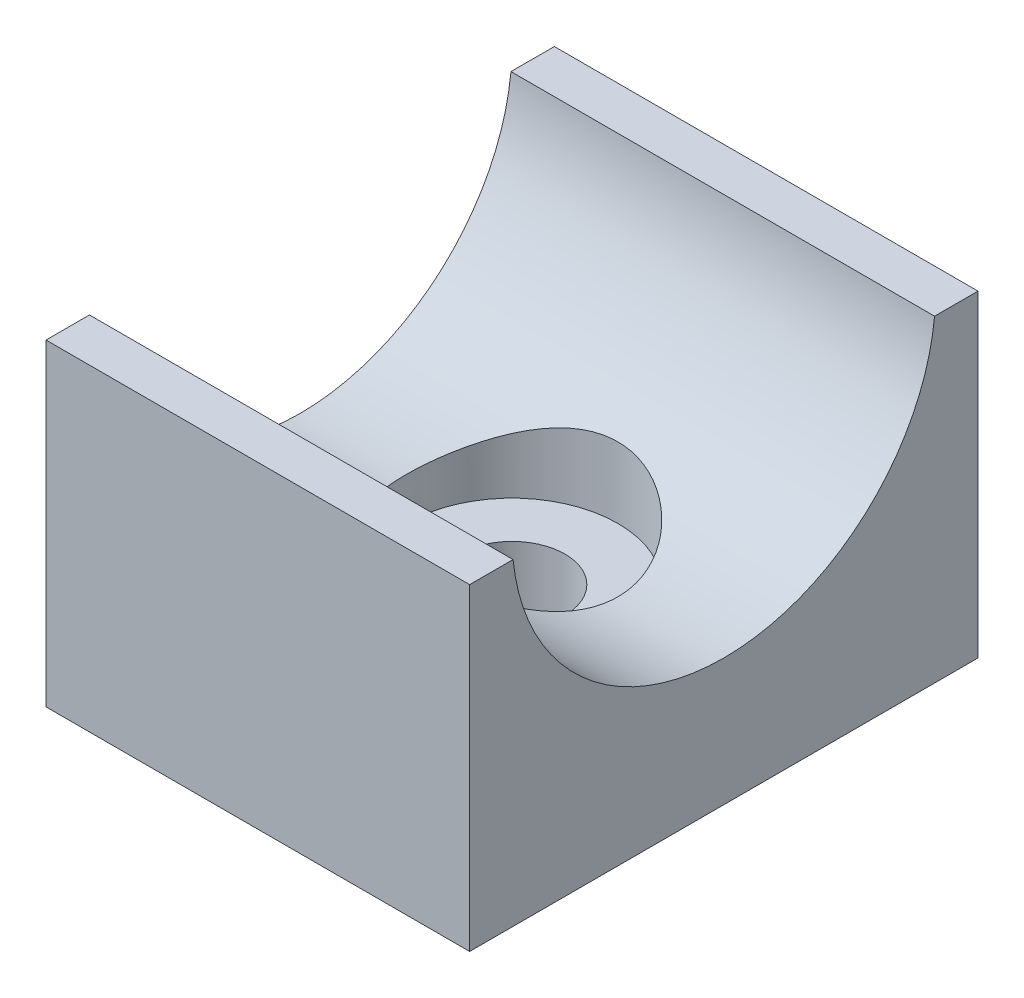
ISO-10303-21;
HEADER;
FILE_DESCRIPTION(('STEP AP214'),'2;1');
FILE_NAME('part.step','',(''),(''),'','','');
FILE_SCHEMA(('AUTOMOTIVE_DESIGN { 1 0 10303 214 1 1 1 1 }'));
ENDSEC;
DATA;
#1=APPLICATION_CONTEXT('core data for automotive mechanical design processes');
#2=APPLICATION_PROTOCOL_DEFINITION('international standard','automotive_design',2000,#1);
#3=PRODUCT_CONTEXT('',#1,'mechanical');
#4=PRODUCT('Part','Part','',(#3));
#5=PRODUCT_RELATED_PRODUCT_CATEGORY('part','',(#4));
#6=PRODUCT_DEFINITION_FORMATION('','',#4);
#7=PRODUCT_DEFINITION_CONTEXT('part definition',#1,'design');
#8=PRODUCT_DEFINITION('design','',#6,#7);
#9=PRODUCT_DEFINITION_SHAPE('','',#8);
#10=(LENGTH_UNIT() NAMED_UNIT(*) SI_UNIT(.MILLI.,.METRE.));
#11=(NAMED_UNIT(*) PLANE_ANGLE_UNIT() SI_UNIT($,.RADIAN.));
#12=(NAMED_UNIT(*) SI_UNIT($,.STERADIAN.) SOLID_ANGLE_UNIT());
#13=UNCERTAINTY_MEASURE_WITH_UNIT(LENGTH_MEASURE(1.E-05),#10,'distance_accuracy_value','');
#14=(GEOMETRIC_REPRESENTATION_CONTEXT(3) GLOBAL_UNCERTAINTY_ASSIGNED_CONTEXT((#13)) GLOBAL_UNIT_ASSIGNED_CONTEXT((#10,
#11,#12)) REPRESENTATION_CONTEXT('',''));
#15=CARTESIAN_POINT('',(0.,0.,0.));
#16=DIRECTION('',(0.,0.,1.));
#17=DIRECTION('',(1.,0.,0.));
#18=AXIS2_PLACEMENT_3D('',#15,#16,#17);
#19=CARTESIAN_POINT('',(12.7,19.05,-15.24));
#20=DIRECTION('',(0.,-1.,0.));
#21=DIRECTION('',(0.,0.,-1.));
#22=AXIS2_PLACEMENT_3D('',#19,#20,#21);
#23=CYLINDRICAL_SURFACE('',#22,3.175);
#24=CARTESIAN_POINT('',(12.7,0.,-15.24));
#25=DIRECTION('',(0.,1.,0.));
#26=DIRECTION('',(0.,0.,1.));
#27=AXIS2_PLACEMENT_3D('',#24,#25,#26);
#28=CIRCLE('',#27,3.175);
#29=CARTESIAN_POINT('',(12.7,0.,-12.065));
#30=VERTEX_POINT('',#29);
#31=EDGE_CURVE('E138',#30,#30,#28,.T.);
#32=ORIENTED_EDGE('',*,*,#31,.F.);
#33=EDGE_LOOP('',(#32));
#34=FACE_BOUND('',#33,.T.);
#35=CARTESIAN_POINT('',(12.7,5.08,-15.24));
#36=DIRECTION('',(0.,1.,0.));
#37=DIRECTION('',(0.,0.,1.));
#38=AXIS2_PLACEMENT_3D('',#35,#36,#37);
#39=CIRCLE('',#38,3.175);
#40=CARTESIAN_POINT('',(12.7,5.08,-12.065));
#41=VERTEX_POINT('',#40);
#42=EDGE_CURVE('E150',#41,#41,#39,.F.);
#43=ORIENTED_EDGE('',*,*,#42,.F.);
#44=EDGE_LOOP('',(#43));
#45=FACE_BOUND('',#44,.T.);
#46=ADVANCED_FACE('F42',(#34,#45),#23,.F.);
#47=CARTESIAN_POINT('',(25.4,0.,0.));
#48=DIRECTION('',(0.,0.,-1.));
#49=DIRECTION('',(-1.,0.,0.));
#50=AXIS2_PLACEMENT_3D('',#47,#48,#49);
#51=PLANE('',#50);
#52=DIRECTION('',(0.,-1.,0.));
#53=VECTOR('',#52,1.);
#54=CARTESIAN_POINT('',(0.,0.,0.));
#55=LINE('',#54,#53);
#56=CARTESIAN_POINT('',(0.,19.05,0.));
#57=VERTEX_POINT('',#56);
#58=CARTESIAN_POINT('',(0.,0.,0.));
#59=VERTEX_POINT('',#58);
#60=EDGE_CURVE('E134',#57,#59,#55,.T.);
#61=ORIENTED_EDGE('',*,*,#60,.T.);
#62=DIRECTION('',(-1.,0.,0.));
#63=VECTOR('',#62,1.);
#64=CARTESIAN_POINT('',(25.4,0.,0.));
#65=LINE('',#64,#63);
#66=CARTESIAN_POINT('',(25.4,0.,0.));
#67=VERTEX_POINT('',#66);
#68=EDGE_CURVE('E12',#67,#59,#65,.T.);
#69=ORIENTED_EDGE('',*,*,#68,.F.);
#70=DIRECTION('',(0.,-1.,0.));
#71=VECTOR('',#70,1.);
#72=CARTESIAN_POINT('',(25.4,0.,0.));
#73=LINE('',#72,#71);
#74=CARTESIAN_POINT('',(25.4,19.05,0.));
#75=VERTEX_POINT('',#74);
#76=EDGE_CURVE('E145',#75,#67,#73,.T.);
#77=ORIENTED_EDGE('',*,*,#76,.F.);
#78=DIRECTION('',(-1.,0.,0.));
#79=VECTOR('',#78,1.);
#80=CARTESIAN_POINT('',(25.4,19.05,0.));
#81=LINE('',#80,#79);
#82=EDGE_CURVE('E130',#75,#57,#81,.T.);
#83=ORIENTED_EDGE('',*,*,#82,.T.);
#84=EDGE_LOOP('',(#61,#69,#77,#83));
#85=FACE_BOUND('',#84,.T.);
#86=ADVANCED_FACE('F44',(#85),#51,.F.);
#87=CARTESIAN_POINT('',(25.4,0.,0.));
#88=DIRECTION('',(0.,1.,0.));
#89=DIRECTION('',(0.,0.,1.));
#90=AXIS2_PLACEMENT_3D('',#87,#88,#89);
#91=PLANE('',#90);
#92=ORIENTED_EDGE('',*,*,#31,.T.);
#93=EDGE_LOOP('',(#92));
#94=FACE_BOUND('',#93,.T.);
#95=DIRECTION('',(0.,0.,-1.));
#96=VECTOR('',#95,1.);
#97=CARTESIAN_POINT('',(0.,0.,0.));
#98=LINE('',#97,#96);
#99=CARTESIAN_POINT('',(0.,0.,-30.48));
#100=VERTEX_POINT('',#99);
#101=EDGE_CURVE('E137',#59,#100,#98,.T.);
#102=ORIENTED_EDGE('',*,*,#101,.T.);
#103=DIRECTION('',(-1.,0.,0.));
#104=VECTOR('',#103,1.);
#105=CARTESIAN_POINT('',(25.4,0.,-30.48));
#106=LINE('',#105,#104);
#107=CARTESIAN_POINT('',(25.4,0.,-30.48));
#108=VERTEX_POINT('',#107);
#109=EDGE_CURVE('E57',#108,#100,#106,.T.);
#110=ORIENTED_EDGE('',*,*,#109,.F.);
#111=DIRECTION('',(0.,0.,-1.));
#112=VECTOR('',#111,1.);
#113=CARTESIAN_POINT('',(25.4,0.,0.));
#114=LINE('',#113,#112);
#115=EDGE_CURVE('E103',#67,#108,#114,.T.);
#116=ORIENTED_EDGE('',*,*,#115,.F.);
#117=ORIENTED_EDGE('',*,*,#68,.T.);
#118=EDGE_LOOP('',(#102,#110,#116,#117));
#119=FACE_BOUND('',#118,.T.);
#120=ADVANCED_FACE('F166',(#94,#119),#91,.F.);
#121=CARTESIAN_POINT('',(25.4,0.,-30.48));
#122=DIRECTION('',(0.,0.,1.));
#123=DIRECTION('',(1.,0.,0.));
#124=AXIS2_PLACEMENT_3D('',#121,#122,#123);
#125=PLANE('',#124);
#126=DIRECTION('',(0.,1.,0.));
#127=VECTOR('',#126,1.);
#128=CARTESIAN_POINT('',(0.,0.,-30.48));
#129=LINE('',#128,#127);
#130=CARTESIAN_POINT('',(0.,19.05,-30.48));
#131=VERTEX_POINT('',#130);
#132=EDGE_CURVE('E140',#100,#131,#129,.T.);
#133=ORIENTED_EDGE('',*,*,#132,.T.);
#134=DIRECTION('',(-1.,0.,0.));
#135=VECTOR('',#134,1.);
#136=CARTESIAN_POINT('',(25.4,19.05,-30.48));
#137=LINE('',#136,#135);
#138=CARTESIAN_POINT('',(25.4,19.05,-30.48));
#139=VERTEX_POINT('',#138);
#140=EDGE_CURVE('E125',#139,#131,#137,.T.);
#141=ORIENTED_EDGE('',*,*,#140,.F.);
#142=DIRECTION('',(0.,1.,0.));
#143=VECTOR('',#142,1.);
#144=CARTESIAN_POINT('',(25.4,0.,-30.48));
#145=LINE('',#144,#143);
#146=EDGE_CURVE('E116',#108,#139,#145,.T.);
#147=ORIENTED_EDGE('',*,*,#146,.F.);
#148=ORIENTED_EDGE('',*,*,#109,.T.);
#149=EDGE_LOOP('',(#133,#141,#147,#148));
#150=FACE_BOUND('',#149,.T.);
#151=ADVANCED_FACE('F169',(#150),#125,.F.);
#152=CARTESIAN_POINT('',(25.4,19.05,-27.8763404512541));
#153=DIRECTION('',(0.,-1.,0.));
#154=DIRECTION('',(0.,0.,-1.));
#155=AXIS2_PLACEMENT_3D('',#152,#153,#154);
#156=PLANE('',#155);
#157=DIRECTION('',(0.,0.,1.));
#158=VECTOR('',#157,1.);
#159=CARTESIAN_POINT('',(0.,19.05,-27.8763404512541));
#160=LINE('',#159,#158);
#161=CARTESIAN_POINT('',(0.,19.05,-27.8763404512541));
#162=VERTEX_POINT('',#161);
#163=EDGE_CURVE('E124',#131,#162,#160,.T.);
#164=ORIENTED_EDGE('',*,*,#163,.T.);
#165=DIRECTION('',(-1.,0.,0.));
#166=VECTOR('',#165,1.);
#167=CARTESIAN_POINT('',(25.4,19.05,-27.8763404512541));
#168=LINE('',#167,#166);
#169=CARTESIAN_POINT('',(25.4,19.05,-27.8763404512541));
#170=VERTEX_POINT('',#169);
#171=EDGE_CURVE('E121',#170,#162,#168,.T.);
#172=ORIENTED_EDGE('',*,*,#171,.F.);
#173=DIRECTION('',(0.,0.,1.));
#174=VECTOR('',#173,1.);
#175=CARTESIAN_POINT('',(25.4,19.05,-27.8763404512541));
#176=LINE('',#175,#174);
#177=EDGE_CURVE('E110',#139,#170,#176,.T.);
#178=ORIENTED_EDGE('',*,*,#177,.F.);
#179=ORIENTED_EDGE('',*,*,#140,.T.);
#180=EDGE_LOOP('',(#164,#172,#178,#179));
#181=FACE_BOUND('',#180,.T.);
#182=ADVANCED_FACE('F122',(#181),#156,.F.);
#183=CARTESIAN_POINT('',(25.4,20.32,-15.24));
#184=DIRECTION('',(-1.,0.,0.));
#185=DIRECTION('',(0.,0.,1.));
#186=AXIS2_PLACEMENT_3D('',#183,#184,#185);
#187=CYLINDRICAL_SURFACE('',#186,12.7);
#188=CARTESIAN_POINT('',(12.7,9.32147737193762,-8.89));
#189=CARTESIAN_POINT('',(12.5344789590249,9.32147642005699,-8.89000071781161));
#190=CARTESIAN_POINT('',(12.3689434883732,9.31772810661446,-8.8964804349605));
#191=CARTESIAN_POINT('',(12.0391482505555,9.30287403604474,-8.92231432961333));
#192=CARTESIAN_POINT('',(11.8748891133291,9.29176485365803,-8.9416745008423));
#193=CARTESIAN_POINT('',(11.5487301381977,9.26258186670705,-8.99305072320687));
#194=CARTESIAN_POINT('',(11.3868344150542,9.24449714114095,-9.02508662166783));
#195=CARTESIAN_POINT('',(11.0667491150663,9.20200448634721,-9.10142682606322));
#196=CARTESIAN_POINT('',(10.9085611824029,9.1775938076974,-9.14573646706065));
#197=CARTESIAN_POINT('',(10.5978491070273,9.12342590997942,-9.24584096724941));
#198=CARTESIAN_POINT('',(10.4452974262377,9.09370053604643,-9.3015676917048));
#199=CARTESIAN_POINT('',(10.1456891130139,9.02971423338027,-9.42413991964666));
#200=CARTESIAN_POINT('',(9.99863463418856,8.995451550481,-9.49098972599722));
#201=CARTESIAN_POINT('',(9.56692148410001,8.88731966845245,-9.7073875338395));
#202=CARTESIAN_POINT('',(9.29141909818349,8.80805233577874,-9.87287966548104));
#203=CARTESIAN_POINT('',(8.7483163070679,8.63619282928589,-10.2573747996654));
#204=CARTESIAN_POINT('',(8.48324177727992,8.54304087481058,-10.4796654905097));
#205=CARTESIAN_POINT('',(7.99203943621564,8.35837017285472,-10.964882423539));
#206=CARTESIAN_POINT('',(7.7659310521132,8.26685226031537,-11.2278288120233));
#207=CARTESIAN_POINT('',(7.45333912917879,8.13454664585376,-11.6581810588134));
#208=CARTESIAN_POINT('',(7.3508668908084,8.08998050886684,-11.8130595701572));
#209=CARTESIAN_POINT('',(7.1594595117803,8.00506092389924,-12.1320334696156));
#210=CARTESIAN_POINT('',(7.07051859795496,7.96470568165328,-12.2961248858836));
#211=CARTESIAN_POINT('',(6.90705206170794,7.88937307174371,-12.6324691683083));
#212=CARTESIAN_POINT('',(6.83252293166016,7.85439439592537,-12.8047200358308));
#213=CARTESIAN_POINT('',(6.69870264323527,7.79085002705441,-13.1561878375221));
#214=CARTESIAN_POINT('',(6.639409866327,7.76228365287499,-13.3354040294464));
#215=CARTESIAN_POINT('',(6.54048157500691,7.71423005093735,-13.6863988982515));
#216=CARTESIAN_POINT('',(6.49974775386153,7.69424152040074,-13.8577997429495));
#217=CARTESIAN_POINT('',(6.4325940667158,7.66112875165631,-14.2040398980828));
#218=CARTESIAN_POINT('',(6.40617357837659,7.64800421500522,-14.3788790586787));
#219=CARTESIAN_POINT('',(6.36800870358457,7.62900556174312,-14.7304543290938));
#220=CARTESIAN_POINT('',(6.35625683819261,7.62312775033797,-14.9071894258518));
#221=CARTESIAN_POINT('',(6.34756882551003,7.61878486541447,-15.2611100399709));
#222=CARTESIAN_POINT('',(6.3506317717729,7.62031933837436,-15.4382955291118));
#223=CARTESIAN_POINT('',(6.37061265961288,7.6302962444174,-15.776139024534));
#224=CARTESIAN_POINT('',(6.38629814259088,7.63812413040212,-15.9368899245854));
#225=CARTESIAN_POINT('',(6.42979708099145,7.65972403867592,-16.2563936420842));
#226=CARTESIAN_POINT('',(6.4576146420864,7.67349807321244,-16.4151457643874));
#227=CARTESIAN_POINT('',(6.52506340961893,7.7066546514692,-16.7294584532589));
#228=CARTESIAN_POINT('',(6.56469052945482,7.72603525501402,-16.8850201039935));
#229=CARTESIAN_POINT('',(6.65537335198242,7.76996260027213,-17.1920837525932));
#230=CARTESIAN_POINT('',(6.70643343198866,7.79451132047609,-17.3435841705995));
#231=CARTESIAN_POINT('',(6.82026333653132,7.8485822881302,-17.6435961838837));
#232=CARTESIAN_POINT('',(6.88318090551182,7.87816677380177,-17.792040524012));
#233=CARTESIAN_POINT('',(7.01972673480682,7.94141556785704,-18.0830375380318));
#234=CARTESIAN_POINT('',(7.09335886519499,7.97508134965865,-18.2255880590976));
#235=CARTESIAN_POINT('',(7.32950455790233,8.08113324347405,-18.6433007767467));
#236=CARTESIAN_POINT('',(7.50733700752065,8.15860800871235,-18.9087059488456));
#237=CARTESIAN_POINT('',(7.91779428710195,8.32838567884807,-19.4321422277039));
#238=CARTESIAN_POINT('',(8.1540094889112,8.42139797894205,-19.6871047743945));
#239=CARTESIAN_POINT('',(8.66518952816838,8.60716102954958,-20.1555793654645));
#240=CARTESIAN_POINT('',(8.94018390104014,8.6999115252269,-20.369059518092));
#241=CARTESIAN_POINT('',(9.38681881570323,8.83423638001303,-20.6603046983943));
#242=CARTESIAN_POINT('',(9.54665968738573,8.87946071878235,-20.7548525398925));
#243=CARTESIAN_POINT('',(9.87490752306776,8.96554731809776,-20.9299830866792));
#244=CARTESIAN_POINT('',(10.0433105782878,9.00641154317183,-21.0105720916642));
#245=CARTESIAN_POINT('',(10.3875884792423,9.08226999906691,-21.1569441469152));
#246=CARTESIAN_POINT('',(10.5634588389774,9.11726769339595,-21.2227359411201));
#247=CARTESIAN_POINT('',(10.9215191016147,9.1800064719304,-21.3387624046693));
#248=CARTESIAN_POINT('',(11.1037081390407,9.20774854553506,-21.3889991953146));
#249=CARTESIAN_POINT('',(11.4582606725721,9.25288691298729,-21.4698457856101));
#250=CARTESIAN_POINT('',(11.6302596051572,9.27092855783565,-21.5016948889478));
#251=CARTESIAN_POINT('',(11.9769418024487,9.2990889592453,-21.5511279129572));
#252=CARTESIAN_POINT('',(12.1516249148929,9.30920816353379,-21.5687126397652));
#253=CARTESIAN_POINT('',(12.5020265041789,9.32108860826949,-21.5893378336054));
#254=CARTESIAN_POINT('',(12.677744291214,9.32285489805144,-21.5923870873364));
#255=CARTESIAN_POINT('',(13.0287031999384,9.3179653426303,-21.5839151277121));
#256=CARTESIAN_POINT('',(13.2039443530021,9.31131006591665,-21.5723948978553));
#257=CARTESIAN_POINT('',(13.5332279332373,9.29104779310985,-21.5370285883473));
#258=CARTESIAN_POINT('',(13.6874858524856,9.2782840465986,-21.5146742712527));
#259=CARTESIAN_POINT('',(13.9933945378934,9.24673425861895,-21.458827425562));
#260=CARTESIAN_POINT('',(14.1450444243412,9.22794622551699,-21.4253312133101));
#261=CARTESIAN_POINT('',(14.4447439677597,9.18493632621383,-21.3475630763557));
#262=CARTESIAN_POINT('',(14.5927940903662,9.16071516698612,-21.3032925535728));
#263=CARTESIAN_POINT('',(14.8845425415143,9.10754654597483,-21.2043974165212));
#264=CARTESIAN_POINT('',(15.0282391462377,9.07859724029688,-21.1497687614191));
#265=CARTESIAN_POINT('',(15.4646936868604,8.98297171876334,-20.9655153726592));
#266=CARTESIAN_POINT('',(15.7490987796552,8.90958388309908,-20.8190770886179));
#267=CARTESIAN_POINT('',(16.2907678711839,8.75308318122911,-20.4869180698689));
#268=CARTESIAN_POINT('',(16.5480178254445,8.66996532912947,-20.3011771558361));
#269=CARTESIAN_POINT('',(17.062333653309,8.49070205678713,-19.8680776263864));
#270=CARTESIAN_POINT('',(17.3152886641333,8.39423517674652,-19.6159031911332));
#271=CARTESIAN_POINT('',(17.6610339893589,8.25483316513904,-19.207691399765));
#272=CARTESIAN_POINT('',(17.7707339818866,8.20921829168895,-19.0665178993435));
#273=CARTESIAN_POINT('',(17.9782052877834,8.1208959823283,-18.7748308921695));
#274=CARTESIAN_POINT('',(18.0759816587189,8.07818731713155,-18.6243213865676));
#275=CARTESIAN_POINT('',(18.2613143065594,7.99568889377902,-18.3105667622671));
#276=CARTESIAN_POINT('',(18.3485234397142,7.95600905451601,-18.1470875265675));
#277=CARTESIAN_POINT('',(18.5086782023377,7.88202591310086,-17.8121944107138));
#278=CARTESIAN_POINT('',(18.581630149332,7.84772023094012,-17.6407840867503));
#279=CARTESIAN_POINT('',(18.712454756968,7.78549557312906,-17.2912653593288));
#280=CARTESIAN_POINT('',(18.7703346102331,7.75757355188161,-17.1131601973542));
#281=CARTESIAN_POINT('',(18.870307055066,7.70896207828177,-16.7516132994379));
#282=CARTESIAN_POINT('',(18.9124015187094,7.68827176830096,-16.5681721990965));
#283=CARTESIAN_POINT('',(18.9770955767513,7.65632292993781,-16.2146000051003));
#284=CARTESIAN_POINT('',(19.0011298887925,7.64437300817646,-16.0447926586732));
#285=CARTESIAN_POINT('',(19.035386692103,7.62730912682273,-15.7034536509147));
#286=CARTESIAN_POINT('',(19.0456102505118,7.62219463906534,-15.5319221238406));
#287=CARTESIAN_POINT('',(19.0521123246777,7.61894399676094,-15.1885802771935));
#288=CARTESIAN_POINT('',(19.0483948989078,7.62080581128592,-15.0167700533108));
#289=CARTESIAN_POINT('',(19.0270728992273,7.63145140008471,-14.6742330527926));
#290=CARTESIAN_POINT('',(19.0094687076187,7.64023498380262,-14.5035062464611));
#291=CARTESIAN_POINT('',(18.9622218272353,7.66367612437398,-14.175737056103));
#292=CARTESIAN_POINT('',(18.9334531330578,7.67790638123025,-14.0185368992336));
#293=CARTESIAN_POINT('',(18.8643046584649,7.71185801081381,-13.7072659863428));
#294=CARTESIAN_POINT('',(18.8239211806658,7.7315811320446,-13.553196243587));
#295=CARTESIAN_POINT('',(18.7319617054456,7.77605947329654,-13.2492350945107));
#296=CARTESIAN_POINT('',(18.6803888595822,7.80081327626966,-13.0993425250498));
#297=CARTESIAN_POINT('',(18.5664919983685,7.8548198903757,-12.8044785072228));
#298=CARTESIAN_POINT('',(18.5041637996234,7.88407445163864,-12.6595090000851));
#299=CARTESIAN_POINT('',(18.3664096224425,7.94778075787735,-12.3692535813078));
#300=CARTESIAN_POINT('',(18.29054054922,7.98240020124094,-12.2242145681467));
#301=CARTESIAN_POINT('',(18.1282602370123,8.05508019657877,-11.9410384656085));
#302=CARTESIAN_POINT('',(18.0418454042382,8.09314192046451,-11.8029037518132));
#303=CARTESIAN_POINT('',(17.7676597433025,8.21126897076233,-11.3998350317219));
#304=CARTESIAN_POINT('',(17.564880017551,8.2953085137682,-11.1460947568409));
#305=CARTESIAN_POINT('',(17.1017684417529,8.47545654919583,-10.6494212249474));
#306=CARTESIAN_POINT('',(16.8377173779495,8.57193379552623,-10.4100765968772));
#307=CARTESIAN_POINT('',(16.4136550577774,8.71220424369563,-10.0860674657194));
#308=CARTESIAN_POINT('',(16.2675022963636,8.75825691382497,-9.98382803174278));
#309=CARTESIAN_POINT('',(15.9664359706633,8.84757906313297,-9.79162677679355));
#310=CARTESIAN_POINT('',(15.8115211914929,8.89084815457237,-9.70166666432259));
#311=CARTESIAN_POINT('',(15.4886795013925,8.97455317649323,-9.53210440726203));
#312=CARTESIAN_POINT('',(15.3204948696752,9.01485420098483,-9.4529256564071));
#313=CARTESIAN_POINT('',(14.9767752598389,9.08954607975584,-9.30927824966651));
#314=CARTESIAN_POINT('',(14.8012441228511,9.12393997573909,-9.24480201750813));
#315=CARTESIAN_POINT('',(14.4444647481629,9.18537538463023,-9.13145791935267));
#316=CARTESIAN_POINT('',(14.2632325648742,9.21243578486616,-9.08254989972412));
#317=CARTESIAN_POINT('',(13.8962222449426,9.25811246698112,-9.00086148892017));
#318=CARTESIAN_POINT('',(13.7104473824064,9.27673465197466,-8.96806982187933));
#319=CARTESIAN_POINT('',(13.3870728150317,9.30087619267086,-8.92578476265151));
#320=CARTESIAN_POINT('',(13.2501333121901,9.30858286496157,-8.91237829471656));
#321=CARTESIAN_POINT('',(12.9754659050201,9.31888402164473,-8.89448531636533));
#322=CARTESIAN_POINT('',(12.8377379485673,9.32147816404288,-8.88999940267473));
#323=CARTESIAN_POINT('',(12.7,9.32147737193762,-8.89));
#324=B_SPLINE_CURVE_WITH_KNOTS('',3,(#188,#189,#190,#191,#192,#193,#194,#195,#196,#197,#198,
#199,#200,#201,#202,#203,#204,#205,#206,#207,#208,#209,#210,#211,#212,#213,#214,#215,#216,#217,
#218,#219,#220,#221,#222,#223,#224,#225,#226,#227,#228,#229,#230,#231,#232,#233,#234,#235,#236,
#237,#238,#239,#240,#241,#242,#243,#244,#245,#246,#247,#248,#249,#250,#251,#252,#253,#254,#255,
#256,#257,#258,#259,#260,#261,#262,#263,#264,#265,#266,#267,#268,#269,#270,#271,#272,#273,#274,
#275,#276,#277,#278,#279,#280,#281,#282,#283,#284,#285,#286,#287,#288,#289,#290,#291,#292,#293,
#294,#295,#296,#297,#298,#299,#300,#301,#302,#303,#304,#305,#306,#307,#308,#309,#310,#311,#312,
#313,#314,#315,#316,#317,#318,#319,#320,#321,#322,#323),.UNSPECIFIED.,.T.,.F.,(4,2,2,2,2,2,2,2,
2,2,2,2,2,2,2,2,2,2,2,2,2,2,2,2,2,2,2,2,2,2,2,2,2,2,2,2,2,2,2,2,2,2,2,2,2,2,2,2,2,2,2,2,2,2,2,2,
2,2,2,2,2,2,2,2,2,2,2,4),(0.,0.496420628386739,0.993072420345693,1.49050495383878,
1.98815404798092,2.48291553757602,2.9778688680815,3.96684409062694,5.03738796841403,
6.1084640479078,6.68078530471614,7.25286169053388,7.82479866524648,8.39667485895433,
8.92786962152973,9.45904128608268,9.9899420168575,10.5208102648014,11.0053494342499,
11.4900527062197,11.9745884449401,12.4593100150646,12.950526958068,13.4419217698919,
14.4241248232063,15.4991729719626,16.5750443780613,17.1478350421015,17.7203665253171,
18.2925587952272,18.8646729984724,19.3914775559145,19.9182523394805,20.4447086470812,
20.9711294186694,21.4397670532095,21.908559779714,22.3772915409525,22.8462065377768,
23.8265350298733,24.8073680830598,25.9118399254557,26.4648639531134,27.017652586129,
27.5853637388287,28.1528227588559,28.7200104808046,29.2871309155676,29.802197945893,
30.3172251753647,30.8321024827272,31.3469656160428,31.827748508727,32.3086846208016,
32.7894854495582,33.2704737135641,33.7718435732797,34.2733847696811,35.2759913103903,
36.3783774564739,36.9304975296672,37.4826943447723,38.0525552763948,38.6221218892067,
39.1902073402293,39.7578947603406,40.1709623989989,40.5840576682025),.UNSPECIFIED.);
#325=CARTESIAN_POINT('',(12.7,9.32147737193762,-8.89));
#326=VERTEX_POINT('',#325);
#327=EDGE_CURVE('E46',#326,#326,#324,.T.);
#328=ORIENTED_EDGE('',*,*,#327,.T.);
#329=EDGE_LOOP('',(#328));
#330=FACE_BOUND('',#329,.T.);
#331=CARTESIAN_POINT('',(0.,20.32,-15.24));
#332=DIRECTION('',(-1.,0.,0.));
#333=DIRECTION('',(0.,0.,-1.));
#334=AXIS2_PLACEMENT_3D('',#331,#332,#333);
#335=CIRCLE('',#334,12.7);
#336=CARTESIAN_POINT('',(0.,19.05,-2.60365954874592));
#337=VERTEX_POINT('',#336);
#338=EDGE_CURVE('E89',#162,#337,#335,.T.);
#339=ORIENTED_EDGE('',*,*,#338,.T.);
#340=DIRECTION('',(-1.,0.,0.));
#341=VECTOR('',#340,1.);
#342=CARTESIAN_POINT('',(25.4,19.05,-2.60365954874592));
#343=LINE('',#342,#341);
#344=CARTESIAN_POINT('',(25.4,19.05,-2.60365954874592));
#345=VERTEX_POINT('',#344);
#346=EDGE_CURVE('E126',#345,#337,#343,.T.);
#347=ORIENTED_EDGE('',*,*,#346,.F.);
#348=CARTESIAN_POINT('',(25.4,20.32,-15.24));
#349=DIRECTION('',(-1.,0.,0.));
#350=DIRECTION('',(0.,0.,-1.));
#351=AXIS2_PLACEMENT_3D('',#348,#349,#350);
#352=CIRCLE('',#351,12.7);
#353=EDGE_CURVE('E114',#170,#345,#352,.T.);
#354=ORIENTED_EDGE('',*,*,#353,.F.);
#355=ORIENTED_EDGE('',*,*,#171,.T.);
#356=EDGE_LOOP('',(#339,#347,#354,#355));
#357=FACE_BOUND('',#356,.T.);
#358=ADVANCED_FACE('F128',(#330,#357),#187,.F.);
#359=CARTESIAN_POINT('',(25.4,19.05,0.));
#360=DIRECTION('',(0.,-1.,0.));
#361=DIRECTION('',(0.,0.,-1.));
#362=AXIS2_PLACEMENT_3D('',#359,#360,#361);
#363=PLANE('',#362);
#364=DIRECTION('',(0.,0.,1.));
#365=VECTOR('',#364,1.);
#366=CARTESIAN_POINT('',(0.,19.05,0.));
#367=LINE('',#366,#365);
#368=EDGE_CURVE('E95',#337,#57,#367,.T.);
#369=ORIENTED_EDGE('',*,*,#368,.T.);
#370=ORIENTED_EDGE('',*,*,#82,.F.);
#371=DIRECTION('',(0.,0.,1.));
#372=VECTOR('',#371,1.);
#373=CARTESIAN_POINT('',(25.4,19.05,0.));
#374=LINE('',#373,#372);
#375=EDGE_CURVE('E66',#345,#75,#374,.T.);
#376=ORIENTED_EDGE('',*,*,#375,.F.);
#377=ORIENTED_EDGE('',*,*,#346,.T.);
#378=EDGE_LOOP('',(#369,#370,#376,#377));
#379=FACE_BOUND('',#378,.T.);
#380=ADVANCED_FACE('F174',(#379),#363,.F.);
#381=CARTESIAN_POINT('',(25.4,20.32,-15.24));
#382=DIRECTION('',(1.,0.,0.));
#383=DIRECTION('',(0.,0.,-1.));
#384=AXIS2_PLACEMENT_3D('',#381,#382,#383);
#385=PLANE('',#384);
#386=ORIENTED_EDGE('',*,*,#76,.T.);
#387=ORIENTED_EDGE('',*,*,#115,.T.);
#388=ORIENTED_EDGE('',*,*,#146,.T.);
#389=ORIENTED_EDGE('',*,*,#177,.T.);
#390=ORIENTED_EDGE('',*,*,#353,.T.);
#391=ORIENTED_EDGE('',*,*,#375,.T.);
#392=EDGE_LOOP('',(#386,#387,#388,#389,#390,#391));
#393=FACE_BOUND('',#392,.T.);
#394=ADVANCED_FACE('F112',(#393),#385,.T.);
#395=CARTESIAN_POINT('',(0.,20.32,-15.24));
#396=DIRECTION('',(1.,0.,0.));
#397=DIRECTION('',(0.,0.,-1.));
#398=AXIS2_PLACEMENT_3D('',#395,#396,#397);
#399=PLANE('',#398);
#400=ORIENTED_EDGE('',*,*,#60,.F.);
#401=ORIENTED_EDGE('',*,*,#368,.F.);
#402=ORIENTED_EDGE('',*,*,#338,.F.);
#403=ORIENTED_EDGE('',*,*,#163,.F.);
#404=ORIENTED_EDGE('',*,*,#132,.F.);
#405=ORIENTED_EDGE('',*,*,#101,.F.);
#406=EDGE_LOOP('',(#400,#401,#402,#403,#404,#405));
#407=FACE_BOUND('',#406,.T.);
#408=ADVANCED_FACE('F172',(#407),#399,.F.);
#409=CARTESIAN_POINT('',(12.7,-17.9605122421383,-15.24));
#410=DIRECTION('',(0.,1.,0.));
#411=DIRECTION('',(0.,0.,1.));
#412=AXIS2_PLACEMENT_3D('',#409,#410,#411);
#413=CYLINDRICAL_SURFACE('',#412,6.35);
#414=CARTESIAN_POINT('',(12.7,5.08,-15.24));
#415=DIRECTION('',(0.,1.,0.));
#416=DIRECTION('',(0.,0.,1.));
#417=AXIS2_PLACEMENT_3D('',#414,#415,#416);
#418=CIRCLE('',#417,6.35);
#419=CARTESIAN_POINT('',(12.7,5.08,-8.89));
#420=VERTEX_POINT('',#419);
#421=EDGE_CURVE('E152',#420,#420,#418,.F.);
#422=ORIENTED_EDGE('',*,*,#421,.T.);
#423=EDGE_LOOP('',(#422));
#424=FACE_BOUND('',#423,.T.);
#425=ORIENTED_EDGE('',*,*,#327,.F.);
#426=EDGE_LOOP('',(#425));
#427=FACE_BOUND('',#426,.T.);
#428=ADVANCED_FACE('F194',(#424,#427),#413,.F.);
#429=CARTESIAN_POINT('',(25.4,5.08,0.));
#430=DIRECTION('',(0.,1.,0.));
#431=DIRECTION('',(0.,0.,1.));
#432=AXIS2_PLACEMENT_3D('',#429,#430,#431);
#433=PLANE('',#432);
#434=ORIENTED_EDGE('',*,*,#421,.F.);
#435=EDGE_LOOP('',(#434));
#436=FACE_BOUND('',#435,.T.);
#437=ORIENTED_EDGE('',*,*,#42,.T.);
#438=EDGE_LOOP('',(#437));
#439=FACE_BOUND('',#438,.T.);
#440=ADVANCED_FACE('F201',(#436,#439),#433,.T.);
#441=CLOSED_SHELL('',(#46,#86,#120,#151,#182,#358,#380,#394,#408,#428,#440));
#442=MANIFOLD_SOLID_BREP('B2',#441);
#443=ADVANCED_BREP_SHAPE_REPRESENTATION('',(#18,#442),#14);
#444=SHAPE_DEFINITION_REPRESENTATION(#9,#443);
ENDSEC;
END-ISO-10303-21;
